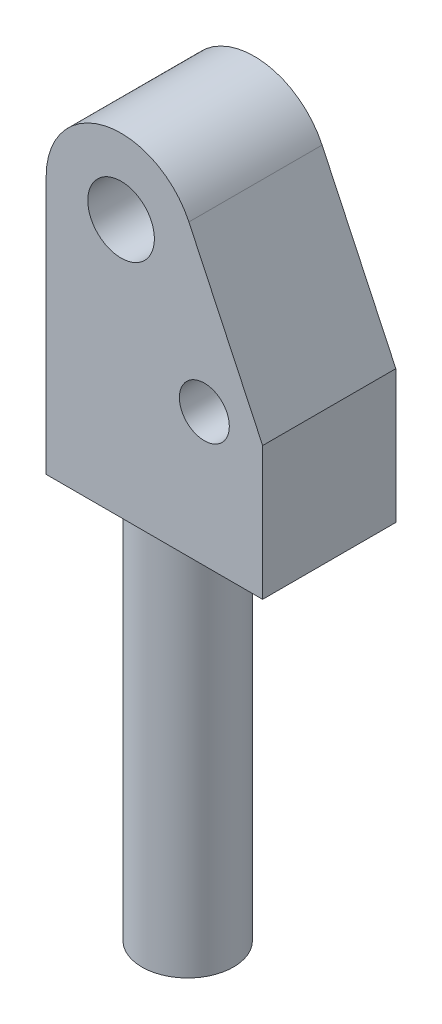
ISO-10303-21;
HEADER;
FILE_DESCRIPTION(('STEP AP214'),'2;1');
FILE_NAME('part.step','',(''),(''),'','','');
FILE_SCHEMA(('AUTOMOTIVE_DESIGN { 1 0 10303 214 1 1 1 1 }'));
ENDSEC;
DATA;
#1=APPLICATION_CONTEXT('core data for automotive mechanical design processes');
#2=APPLICATION_PROTOCOL_DEFINITION('international standard','automotive_design',2000,#1);
#3=PRODUCT_CONTEXT('',#1,'mechanical');
#4=PRODUCT('Part','Part','',(#3));
#5=PRODUCT_RELATED_PRODUCT_CATEGORY('part','',(#4));
#6=PRODUCT_DEFINITION_FORMATION('','',#4);
#7=PRODUCT_DEFINITION_CONTEXT('part definition',#1,'design');
#8=PRODUCT_DEFINITION('design','',#6,#7);
#9=PRODUCT_DEFINITION_SHAPE('','',#8);
#10=(LENGTH_UNIT() NAMED_UNIT(*) SI_UNIT(.MILLI.,.METRE.));
#11=(NAMED_UNIT(*) PLANE_ANGLE_UNIT() SI_UNIT($,.RADIAN.));
#12=(NAMED_UNIT(*) SI_UNIT($,.STERADIAN.) SOLID_ANGLE_UNIT());
#13=UNCERTAINTY_MEASURE_WITH_UNIT(LENGTH_MEASURE(1.E-05),#10,'distance_accuracy_value','');
#14=(GEOMETRIC_REPRESENTATION_CONTEXT(3) GLOBAL_UNCERTAINTY_ASSIGNED_CONTEXT((#13)) GLOBAL_UNIT_ASSIGNED_CONTEXT((#10,
#11,#12)) REPRESENTATION_CONTEXT('',''));
#15=CARTESIAN_POINT('',(0.,0.,0.));
#16=DIRECTION('',(0.,0.,1.));
#17=DIRECTION('',(1.,0.,0.));
#18=AXIS2_PLACEMENT_3D('',#15,#16,#17);
#19=CARTESIAN_POINT('',(0.,48.,0.));
#20=DIRECTION('',(0.,-1.,0.));
#21=DIRECTION('',(0.,0.,-1.));
#22=AXIS2_PLACEMENT_3D('',#19,#20,#21);
#23=CYLINDRICAL_SURFACE('',#22,5.5);
#24=CARTESIAN_POINT('',(0.,47.,0.));
#25=DIRECTION('',(0.,1.,0.));
#26=DIRECTION('',(0.,0.,1.));
#27=AXIS2_PLACEMENT_3D('',#24,#25,#26);
#28=CIRCLE('',#27,5.5);
#29=CARTESIAN_POINT('',(0.,47.,5.5));
#30=VERTEX_POINT('',#29);
#31=EDGE_CURVE('E11',#30,#30,#28,.F.);
#32=ORIENTED_EDGE('',*,*,#31,.T.);
#33=EDGE_LOOP('',(#32));
#34=FACE_BOUND('',#33,.T.);
#35=CARTESIAN_POINT('',(0.,0.,0.));
#36=DIRECTION('',(0.,1.,0.));
#37=DIRECTION('',(0.,0.,1.));
#38=AXIS2_PLACEMENT_3D('',#35,#36,#37);
#39=CIRCLE('',#38,5.5);
#40=CARTESIAN_POINT('',(0.,0.,5.5));
#41=VERTEX_POINT('',#40);
#42=EDGE_CURVE('E139',#41,#41,#39,.T.);
#43=ORIENTED_EDGE('',*,*,#42,.T.);
#44=EDGE_LOOP('',(#43));
#45=FACE_BOUND('',#44,.T.);
#46=ADVANCED_FACE('F43',(#34,#45),#23,.T.);
#47=CARTESIAN_POINT('',(0.,0.,0.));
#48=DIRECTION('',(0.,1.,0.));
#49=DIRECTION('',(0.,0.,1.));
#50=AXIS2_PLACEMENT_3D('',#47,#48,#49);
#51=PLANE('',#50);
#52=ORIENTED_EDGE('',*,*,#42,.F.);
#53=EDGE_LOOP('',(#52));
#54=FACE_BOUND('',#53,.T.);
#55=ADVANCED_FACE('F157',(#54),#51,.F.);
#56=CARTESIAN_POINT('',(0.,79.,8.));
#57=DIRECTION('',(0.,0.,1.));
#58=DIRECTION('',(1.,0.,0.));
#59=AXIS2_PLACEMENT_3D('',#56,#57,#58);
#60=PLANE('',#59);
#61=CARTESIAN_POINT('',(0.,79.,8.));
#62=DIRECTION('',(0.,0.,1.));
#63=DIRECTION('',(1.,0.,0.));
#64=AXIS2_PLACEMENT_3D('',#61,#62,#63);
#65=CIRCLE('',#64,4.00000000000001);
#66=CARTESIAN_POINT('',(4.00000000000001,79.,8.));
#67=VERTEX_POINT('',#66);
#68=EDGE_CURVE('E127',#67,#67,#65,.T.);
#69=ORIENTED_EDGE('',*,*,#68,.F.);
#70=EDGE_LOOP('',(#69));
#71=FACE_BOUND('',#70,.T.);
#72=DIRECTION('',(1.,0.,0.));
#73=VECTOR('',#72,1.);
#74=CARTESIAN_POINT('',(0.,48.,8.));
#75=LINE('',#74,#73);
#76=CARTESIAN_POINT('',(-9.,48.,8.));
#77=VERTEX_POINT('',#76);
#78=CARTESIAN_POINT('',(17.,48.,8.));
#79=VERTEX_POINT('',#78);
#80=EDGE_CURVE('E94',#77,#79,#75,.T.);
#81=ORIENTED_EDGE('',*,*,#80,.T.);
#82=DIRECTION('',(0.,1.,0.));
#83=VECTOR('',#82,1.);
#84=CARTESIAN_POINT('',(17.,48.,8.));
#85=LINE('',#84,#83);
#86=CARTESIAN_POINT('',(17.,64.,8.));
#87=VERTEX_POINT('',#86);
#88=EDGE_CURVE('E106',#79,#87,#85,.T.);
#89=ORIENTED_EDGE('',*,*,#88,.T.);
#90=DIRECTION('',(-0.425577985979848,0.90492175233516,0.));
#91=VECTOR('',#90,1.);
#92=CARTESIAN_POINT('',(17.,64.,8.));
#93=LINE('',#92,#91);
#94=CARTESIAN_POINT('',(8.14429577101644,82.8302018738186,8.));
#95=VERTEX_POINT('',#94);
#96=EDGE_CURVE('E97',#87,#95,#93,.T.);
#97=ORIENTED_EDGE('',*,*,#96,.T.);
#98=CARTESIAN_POINT('',(0.,79.,8.));
#99=DIRECTION('',(0.,0.,1.));
#100=DIRECTION('',(1.,0.,0.));
#101=AXIS2_PLACEMENT_3D('',#98,#99,#100);
#102=CIRCLE('',#101,9.);
#103=CARTESIAN_POINT('',(-9.,79.,8.));
#104=VERTEX_POINT('',#103);
#105=EDGE_CURVE('E102',#95,#104,#102,.T.);
#106=ORIENTED_EDGE('',*,*,#105,.T.);
#107=DIRECTION('',(0.,-1.,0.));
#108=VECTOR('',#107,1.);
#109=CARTESIAN_POINT('',(-9.,48.,8.));
#110=LINE('',#109,#108);
#111=EDGE_CURVE('E64',#104,#77,#110,.T.);
#112=ORIENTED_EDGE('',*,*,#111,.T.);
#113=EDGE_LOOP('',(#81,#89,#97,#106,#112));
#114=FACE_BOUND('',#113,.T.);
#115=CARTESIAN_POINT('',(10.,64.,8.));
#116=DIRECTION('',(0.,0.,1.));
#117=DIRECTION('',(1.,0.,0.));
#118=AXIS2_PLACEMENT_3D('',#115,#116,#117);
#119=CIRCLE('',#118,3.);
#120=CARTESIAN_POINT('',(13.,64.,8.));
#121=VERTEX_POINT('',#120);
#122=EDGE_CURVE('E196',#121,#121,#119,.T.);
#123=ORIENTED_EDGE('',*,*,#122,.F.);
#124=EDGE_LOOP('',(#123));
#125=FACE_BOUND('',#124,.T.);
#126=ADVANCED_FACE('F101',(#71,#114,#125),#60,.T.);
#127=CARTESIAN_POINT('',(0.,79.,-8.));
#128=DIRECTION('',(0.,0.,1.));
#129=DIRECTION('',(1.,0.,0.));
#130=AXIS2_PLACEMENT_3D('',#127,#128,#129);
#131=PLANE('',#130);
#132=DIRECTION('',(1.,0.,0.));
#133=VECTOR('',#132,1.);
#134=CARTESIAN_POINT('',(0.,48.,-8.));
#135=LINE('',#134,#133);
#136=CARTESIAN_POINT('',(-9.,48.,-8.));
#137=VERTEX_POINT('',#136);
#138=CARTESIAN_POINT('',(17.,48.,-8.));
#139=VERTEX_POINT('',#138);
#140=EDGE_CURVE('E86',#137,#139,#135,.T.);
#141=ORIENTED_EDGE('',*,*,#140,.F.);
#142=DIRECTION('',(0.,-1.,0.));
#143=VECTOR('',#142,1.);
#144=CARTESIAN_POINT('',(-9.,48.,-8.));
#145=LINE('',#144,#143);
#146=CARTESIAN_POINT('',(-9.,79.,-8.));
#147=VERTEX_POINT('',#146);
#148=EDGE_CURVE('E128',#147,#137,#145,.T.);
#149=ORIENTED_EDGE('',*,*,#148,.F.);
#150=CARTESIAN_POINT('',(0.,79.,-8.));
#151=DIRECTION('',(0.,0.,1.));
#152=DIRECTION('',(1.,0.,0.));
#153=AXIS2_PLACEMENT_3D('',#150,#151,#152);
#154=CIRCLE('',#153,9.);
#155=CARTESIAN_POINT('',(8.14429577101644,82.8302018738186,-8.));
#156=VERTEX_POINT('',#155);
#157=EDGE_CURVE('E82',#156,#147,#154,.T.);
#158=ORIENTED_EDGE('',*,*,#157,.F.);
#159=DIRECTION('',(-0.425577985979848,0.90492175233516,0.));
#160=VECTOR('',#159,1.);
#161=CARTESIAN_POINT('',(17.,64.,-8.));
#162=LINE('',#161,#160);
#163=CARTESIAN_POINT('',(17.,64.,-8.));
#164=VERTEX_POINT('',#163);
#165=EDGE_CURVE('E111',#164,#156,#162,.T.);
#166=ORIENTED_EDGE('',*,*,#165,.F.);
#167=DIRECTION('',(0.,1.,0.));
#168=VECTOR('',#167,1.);
#169=CARTESIAN_POINT('',(17.,48.,-8.));
#170=LINE('',#169,#168);
#171=EDGE_CURVE('E121',#139,#164,#170,.T.);
#172=ORIENTED_EDGE('',*,*,#171,.F.);
#173=EDGE_LOOP('',(#141,#149,#158,#166,#172));
#174=FACE_BOUND('',#173,.T.);
#175=CARTESIAN_POINT('',(0.,79.,-8.));
#176=DIRECTION('',(0.,0.,1.));
#177=DIRECTION('',(1.,0.,0.));
#178=AXIS2_PLACEMENT_3D('',#175,#176,#177);
#179=CIRCLE('',#178,4.00000000000001);
#180=CARTESIAN_POINT('',(4.00000000000001,79.,-8.));
#181=VERTEX_POINT('',#180);
#182=EDGE_CURVE('E198',#181,#181,#179,.T.);
#183=ORIENTED_EDGE('',*,*,#182,.T.);
#184=EDGE_LOOP('',(#183));
#185=FACE_BOUND('',#184,.T.);
#186=CARTESIAN_POINT('',(10.,64.,-8.));
#187=DIRECTION('',(0.,0.,1.));
#188=DIRECTION('',(1.,0.,0.));
#189=AXIS2_PLACEMENT_3D('',#186,#187,#188);
#190=CIRCLE('',#189,3.);
#191=CARTESIAN_POINT('',(13.,64.,-8.));
#192=VERTEX_POINT('',#191);
#193=EDGE_CURVE('E205',#192,#192,#190,.T.);
#194=ORIENTED_EDGE('',*,*,#193,.T.);
#195=EDGE_LOOP('',(#194));
#196=FACE_BOUND('',#195,.T.);
#197=ADVANCED_FACE('F168',(#174,#185,#196),#131,.F.);
#198=CARTESIAN_POINT('',(0.,48.,8.));
#199=DIRECTION('',(0.,1.,0.));
#200=DIRECTION('',(0.,0.,1.));
#201=AXIS2_PLACEMENT_3D('',#198,#199,#200);
#202=PLANE('',#201);
#203=CARTESIAN_POINT('',(0.,48.,0.));
#204=DIRECTION('',(0.,1.,0.));
#205=DIRECTION('',(0.,0.,1.));
#206=AXIS2_PLACEMENT_3D('',#203,#204,#205);
#207=CIRCLE('',#206,6.50000000000001);
#208=CARTESIAN_POINT('',(0.,48.,6.50000000000001));
#209=VERTEX_POINT('',#208);
#210=EDGE_CURVE('E52',#209,#209,#207,.T.);
#211=ORIENTED_EDGE('',*,*,#210,.T.);
#212=EDGE_LOOP('',(#211));
#213=FACE_BOUND('',#212,.T.);
#214=ORIENTED_EDGE('',*,*,#140,.T.);
#215=DIRECTION('',(0.,0.,-1.));
#216=VECTOR('',#215,1.);
#217=CARTESIAN_POINT('',(17.,48.,8.));
#218=LINE('',#217,#216);
#219=EDGE_CURVE('E137',#79,#139,#218,.T.);
#220=ORIENTED_EDGE('',*,*,#219,.F.);
#221=ORIENTED_EDGE('',*,*,#80,.F.);
#222=DIRECTION('',(0.,0.,-1.));
#223=VECTOR('',#222,1.);
#224=CARTESIAN_POINT('',(-9.,48.,8.));
#225=LINE('',#224,#223);
#226=EDGE_CURVE('E117',#77,#137,#225,.T.);
#227=ORIENTED_EDGE('',*,*,#226,.T.);
#228=EDGE_LOOP('',(#214,#220,#221,#227));
#229=FACE_BOUND('',#228,.T.);
#230=ADVANCED_FACE('F145',(#213,#229),#202,.F.);
#231=CARTESIAN_POINT('',(17.,48.,8.));
#232=DIRECTION('',(-1.,0.,0.));
#233=DIRECTION('',(0.,0.,1.));
#234=AXIS2_PLACEMENT_3D('',#231,#232,#233);
#235=PLANE('',#234);
#236=ORIENTED_EDGE('',*,*,#171,.T.);
#237=DIRECTION('',(0.,0.,-1.));
#238=VECTOR('',#237,1.);
#239=CARTESIAN_POINT('',(17.,64.,8.));
#240=LINE('',#239,#238);
#241=EDGE_CURVE('E113',#87,#164,#240,.T.);
#242=ORIENTED_EDGE('',*,*,#241,.F.);
#243=ORIENTED_EDGE('',*,*,#88,.F.);
#244=ORIENTED_EDGE('',*,*,#219,.T.);
#245=EDGE_LOOP('',(#236,#242,#243,#244));
#246=FACE_BOUND('',#245,.T.);
#247=ADVANCED_FACE('F166',(#246),#235,.F.);
#248=CARTESIAN_POINT('',(17.,64.,8.));
#249=DIRECTION('',(-0.90492175233516,-0.425577985979848,0.));
#250=DIRECTION('',(0.425577985979848,-0.90492175233516,0.));
#251=AXIS2_PLACEMENT_3D('',#248,#249,#250);
#252=PLANE('',#251);
#253=ORIENTED_EDGE('',*,*,#165,.T.);
#254=DIRECTION('',(0.,0.,-1.));
#255=VECTOR('',#254,1.);
#256=CARTESIAN_POINT('',(8.14429577101644,82.8302018738186,8.));
#257=LINE('',#256,#255);
#258=EDGE_CURVE('E112',#95,#156,#257,.T.);
#259=ORIENTED_EDGE('',*,*,#258,.F.);
#260=ORIENTED_EDGE('',*,*,#96,.F.);
#261=ORIENTED_EDGE('',*,*,#241,.T.);
#262=EDGE_LOOP('',(#253,#259,#260,#261));
#263=FACE_BOUND('',#262,.T.);
#264=ADVANCED_FACE('F115',(#263),#252,.F.);
#265=CARTESIAN_POINT('',(0.,79.,8.));
#266=DIRECTION('',(0.,0.,-1.));
#267=DIRECTION('',(-1.,0.,0.));
#268=AXIS2_PLACEMENT_3D('',#265,#266,#267);
#269=CYLINDRICAL_SURFACE('',#268,9.);
#270=ORIENTED_EDGE('',*,*,#157,.T.);
#271=DIRECTION('',(0.,0.,-1.));
#272=VECTOR('',#271,1.);
#273=CARTESIAN_POINT('',(-9.,79.,8.));
#274=LINE('',#273,#272);
#275=EDGE_CURVE('E119',#104,#147,#274,.T.);
#276=ORIENTED_EDGE('',*,*,#275,.F.);
#277=ORIENTED_EDGE('',*,*,#105,.F.);
#278=ORIENTED_EDGE('',*,*,#258,.T.);
#279=EDGE_LOOP('',(#270,#276,#277,#278));
#280=FACE_BOUND('',#279,.T.);
#281=ADVANCED_FACE('F120',(#280),#269,.T.);
#282=CARTESIAN_POINT('',(-9.,48.,8.));
#283=DIRECTION('',(1.,0.,0.));
#284=DIRECTION('',(0.,0.,-1.));
#285=AXIS2_PLACEMENT_3D('',#282,#283,#284);
#286=PLANE('',#285);
#287=ORIENTED_EDGE('',*,*,#148,.T.);
#288=ORIENTED_EDGE('',*,*,#226,.F.);
#289=ORIENTED_EDGE('',*,*,#111,.F.);
#290=ORIENTED_EDGE('',*,*,#275,.T.);
#291=EDGE_LOOP('',(#287,#288,#289,#290));
#292=FACE_BOUND('',#291,.T.);
#293=ADVANCED_FACE('F178',(#292),#286,.F.);
#294=CARTESIAN_POINT('',(0.,79.,8.));
#295=DIRECTION('',(0.,0.,-1.));
#296=DIRECTION('',(-1.,0.,0.));
#297=AXIS2_PLACEMENT_3D('',#294,#295,#296);
#298=CYLINDRICAL_SURFACE('',#297,4.00000000000001);
#299=ORIENTED_EDGE('',*,*,#68,.T.);
#300=EDGE_LOOP('',(#299));
#301=FACE_BOUND('',#300,.T.);
#302=ORIENTED_EDGE('',*,*,#182,.F.);
#303=EDGE_LOOP('',(#302));
#304=FACE_BOUND('',#303,.T.);
#305=ADVANCED_FACE('F152',(#301,#304),#298,.F.);
#306=CARTESIAN_POINT('',(10.,64.,8.));
#307=DIRECTION('',(0.,0.,-1.));
#308=DIRECTION('',(-1.,0.,0.));
#309=AXIS2_PLACEMENT_3D('',#306,#307,#308);
#310=CYLINDRICAL_SURFACE('',#309,3.);
#311=ORIENTED_EDGE('',*,*,#122,.T.);
#312=EDGE_LOOP('',(#311));
#313=FACE_BOUND('',#312,.T.);
#314=ORIENTED_EDGE('',*,*,#193,.F.);
#315=EDGE_LOOP('',(#314));
#316=FACE_BOUND('',#315,.T.);
#317=ADVANCED_FACE('F146',(#313,#316),#310,.F.);
#318=CARTESIAN_POINT('',(0.,48.,0.));
#319=DIRECTION('',(0.,1.,0.));
#320=DIRECTION('',(0.,0.,1.));
#321=AXIS2_PLACEMENT_3D('',#318,#319,#320);
#322=CONICAL_SURFACE('',#321,6.50000000000001,0.785398163397455);
#323=ORIENTED_EDGE('',*,*,#31,.F.);
#324=EDGE_LOOP('',(#323));
#325=FACE_BOUND('',#324,.T.);
#326=ORIENTED_EDGE('',*,*,#210,.F.);
#327=EDGE_LOOP('',(#326));
#328=FACE_BOUND('',#327,.T.);
#329=ADVANCED_FACE('F46',(#325,#328),#322,.T.);
#330=CLOSED_SHELL('',(#46,#55,#126,#197,#230,#247,#264,#281,#293,#305,#317,#329));
#331=MANIFOLD_SOLID_BREP('B2',#330);
#332=ADVANCED_BREP_SHAPE_REPRESENTATION('',(#18,#331),#14);
#333=SHAPE_DEFINITION_REPRESENTATION(#9,#332);
ENDSEC;
END-ISO-10303-21;
